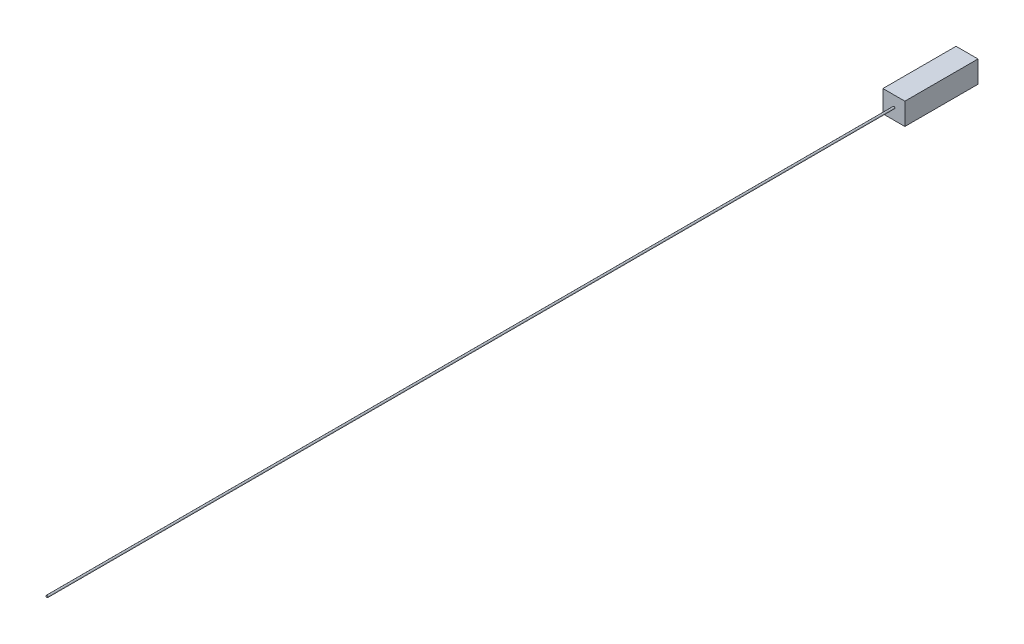
ISO-10303-21;
HEADER;
FILE_DESCRIPTION(('STEP AP214'),'2;1');
FILE_NAME('part.step','',(''),(''),'','','');
FILE_SCHEMA(('AUTOMOTIVE_DESIGN { 1 0 10303 214 1 1 1 1 }'));
ENDSEC;
DATA;
#1=APPLICATION_CONTEXT('core data for automotive mechanical design processes');
#2=APPLICATION_PROTOCOL_DEFINITION('international standard','automotive_design',2000,#1);
#3=PRODUCT_CONTEXT('',#1,'mechanical');
#4=PRODUCT('Part','Part','',(#3));
#5=PRODUCT_RELATED_PRODUCT_CATEGORY('part','',(#4));
#6=PRODUCT_DEFINITION_FORMATION('','',#4);
#7=PRODUCT_DEFINITION_CONTEXT('part definition',#1,'design');
#8=PRODUCT_DEFINITION('design','',#6,#7);
#9=PRODUCT_DEFINITION_SHAPE('','',#8);
#10=(LENGTH_UNIT() NAMED_UNIT(*) SI_UNIT(.MILLI.,.METRE.));
#11=(NAMED_UNIT(*) PLANE_ANGLE_UNIT() SI_UNIT($,.RADIAN.));
#12=(NAMED_UNIT(*) SI_UNIT($,.STERADIAN.) SOLID_ANGLE_UNIT());
#13=UNCERTAINTY_MEASURE_WITH_UNIT(LENGTH_MEASURE(1.E-05),#10,'distance_accuracy_value','');
#14=(GEOMETRIC_REPRESENTATION_CONTEXT(3) GLOBAL_UNCERTAINTY_ASSIGNED_CONTEXT((#13)) GLOBAL_UNIT_ASSIGNED_CONTEXT((#10,
#11,#12)) REPRESENTATION_CONTEXT('',''));
#15=CARTESIAN_POINT('',(0.,0.,0.));
#16=DIRECTION('',(0.,0.,1.));
#17=DIRECTION('',(1.,0.,0.));
#18=AXIS2_PLACEMENT_3D('',#15,#16,#17);
#19=CARTESIAN_POINT('',(-2.85,2.85,19.));
#20=DIRECTION('',(1.,0.,0.));
#21=DIRECTION('',(0.,1.,0.));
#22=AXIS2_PLACEMENT_3D('',#19,#20,#21);
#23=PLANE('',#22);
#24=DIRECTION('',(0.,-1.,0.));
#25=VECTOR('',#24,1.);
#26=CARTESIAN_POINT('',(-2.85,2.85,0.));
#27=LINE('',#26,#25);
#28=CARTESIAN_POINT('',(-2.85,2.85,0.));
#29=VERTEX_POINT('',#28);
#30=CARTESIAN_POINT('',(-2.85,-2.85,0.));
#31=VERTEX_POINT('',#30);
#32=EDGE_CURVE('E100',#29,#31,#27,.T.);
#33=ORIENTED_EDGE('',*,*,#32,.T.);
#34=DIRECTION('',(0.,0.,-1.));
#35=VECTOR('',#34,1.);
#36=CARTESIAN_POINT('',(-2.85,-2.85,19.));
#37=LINE('',#36,#35);
#38=CARTESIAN_POINT('',(-2.85,-2.85,19.));
#39=VERTEX_POINT('',#38);
#40=EDGE_CURVE('E42',#39,#31,#37,.T.);
#41=ORIENTED_EDGE('',*,*,#40,.F.);
#42=DIRECTION('',(0.,-1.,0.));
#43=VECTOR('',#42,1.);
#44=CARTESIAN_POINT('',(-2.85,2.85,19.));
#45=LINE('',#44,#43);
#46=CARTESIAN_POINT('',(-2.85,2.85,19.));
#47=VERTEX_POINT('',#46);
#48=EDGE_CURVE('E86',#47,#39,#45,.T.);
#49=ORIENTED_EDGE('',*,*,#48,.F.);
#50=DIRECTION('',(0.,0.,-1.));
#51=VECTOR('',#50,1.);
#52=CARTESIAN_POINT('',(-2.85,2.85,19.));
#53=LINE('',#52,#51);
#54=EDGE_CURVE('E96',#47,#29,#53,.T.);
#55=ORIENTED_EDGE('',*,*,#54,.T.);
#56=EDGE_LOOP('',(#33,#41,#49,#55));
#57=FACE_BOUND('',#56,.T.);
#58=ADVANCED_FACE('F34',(#57),#23,.F.);
#59=CARTESIAN_POINT('',(2.85,-2.85,19.));
#60=DIRECTION('',(0.,1.,0.));
#61=DIRECTION('',(-1.,0.,0.));
#62=AXIS2_PLACEMENT_3D('',#59,#60,#61);
#63=PLANE('',#62);
#64=DIRECTION('',(1.,0.,0.));
#65=VECTOR('',#64,1.);
#66=CARTESIAN_POINT('',(2.85,-2.85,0.));
#67=LINE('',#66,#65);
#68=CARTESIAN_POINT('',(2.85,-2.85,0.));
#69=VERTEX_POINT('',#68);
#70=EDGE_CURVE('E91',#31,#69,#67,.T.);
#71=ORIENTED_EDGE('',*,*,#70,.T.);
#72=DIRECTION('',(0.,0.,-1.));
#73=VECTOR('',#72,1.);
#74=CARTESIAN_POINT('',(2.85,-2.85,19.));
#75=LINE('',#74,#73);
#76=CARTESIAN_POINT('',(2.85,-2.85,19.));
#77=VERTEX_POINT('',#76);
#78=EDGE_CURVE('E89',#77,#69,#75,.T.);
#79=ORIENTED_EDGE('',*,*,#78,.F.);
#80=DIRECTION('',(1.,0.,0.));
#81=VECTOR('',#80,1.);
#82=CARTESIAN_POINT('',(2.85,-2.85,19.));
#83=LINE('',#82,#81);
#84=EDGE_CURVE('E81',#39,#77,#83,.T.);
#85=ORIENTED_EDGE('',*,*,#84,.F.);
#86=ORIENTED_EDGE('',*,*,#40,.T.);
#87=EDGE_LOOP('',(#71,#79,#85,#86));
#88=FACE_BOUND('',#87,.T.);
#89=ADVANCED_FACE('F90',(#88),#63,.F.);
#90=CARTESIAN_POINT('',(2.85,2.85,19.));
#91=DIRECTION('',(-1.,0.,0.));
#92=DIRECTION('',(0.,-1.,0.));
#93=AXIS2_PLACEMENT_3D('',#90,#91,#92);
#94=PLANE('',#93);
#95=DIRECTION('',(0.,1.,0.));
#96=VECTOR('',#95,1.);
#97=CARTESIAN_POINT('',(2.85,2.85,0.));
#98=LINE('',#97,#96);
#99=CARTESIAN_POINT('',(2.85,2.85,0.));
#100=VERTEX_POINT('',#99);
#101=EDGE_CURVE('E67',#69,#100,#98,.T.);
#102=ORIENTED_EDGE('',*,*,#101,.T.);
#103=DIRECTION('',(0.,0.,-1.));
#104=VECTOR('',#103,1.);
#105=CARTESIAN_POINT('',(2.85,2.85,19.));
#106=LINE('',#105,#104);
#107=CARTESIAN_POINT('',(2.85,2.85,19.));
#108=VERTEX_POINT('',#107);
#109=EDGE_CURVE('E92',#108,#100,#106,.T.);
#110=ORIENTED_EDGE('',*,*,#109,.F.);
#111=DIRECTION('',(0.,1.,0.));
#112=VECTOR('',#111,1.);
#113=CARTESIAN_POINT('',(2.85,2.85,19.));
#114=LINE('',#113,#112);
#115=EDGE_CURVE('E84',#77,#108,#114,.T.);
#116=ORIENTED_EDGE('',*,*,#115,.F.);
#117=ORIENTED_EDGE('',*,*,#78,.T.);
#118=EDGE_LOOP('',(#102,#110,#116,#117));
#119=FACE_BOUND('',#118,.T.);
#120=ADVANCED_FACE('F94',(#119),#94,.F.);
#121=CARTESIAN_POINT('',(2.85,2.85,19.));
#122=DIRECTION('',(0.,-1.,0.));
#123=DIRECTION('',(1.,0.,0.));
#124=AXIS2_PLACEMENT_3D('',#121,#122,#123);
#125=PLANE('',#124);
#126=DIRECTION('',(-1.,0.,0.));
#127=VECTOR('',#126,1.);
#128=CARTESIAN_POINT('',(2.85,2.85,0.));
#129=LINE('',#128,#127);
#130=EDGE_CURVE('E73',#100,#29,#129,.T.);
#131=ORIENTED_EDGE('',*,*,#130,.T.);
#132=ORIENTED_EDGE('',*,*,#54,.F.);
#133=DIRECTION('',(-1.,0.,0.));
#134=VECTOR('',#133,1.);
#135=CARTESIAN_POINT('',(2.85,2.85,19.));
#136=LINE('',#135,#134);
#137=EDGE_CURVE('E50',#108,#47,#136,.T.);
#138=ORIENTED_EDGE('',*,*,#137,.F.);
#139=ORIENTED_EDGE('',*,*,#109,.T.);
#140=EDGE_LOOP('',(#131,#132,#138,#139));
#141=FACE_BOUND('',#140,.T.);
#142=ADVANCED_FACE('F122',(#141),#125,.F.);
#143=CARTESIAN_POINT('',(0.,0.,19.));
#144=DIRECTION('',(0.,0.,-1.));
#145=DIRECTION('',(-1.,0.,0.));
#146=AXIS2_PLACEMENT_3D('',#143,#144,#145);
#147=PLANE('',#146);
#148=CARTESIAN_POINT('',(0.,0.,19.));
#149=DIRECTION('',(0.,0.,-1.));
#150=DIRECTION('',(-1.,0.,0.));
#151=AXIS2_PLACEMENT_3D('',#148,#149,#150);
#152=CIRCLE('',#151,0.25);
#153=CARTESIAN_POINT('',(-0.25,0.,19.));
#154=VERTEX_POINT('',#153);
#155=EDGE_CURVE('E11',#154,#154,#152,.F.);
#156=ORIENTED_EDGE('',*,*,#155,.F.);
#157=EDGE_LOOP('',(#156));
#158=FACE_BOUND('',#157,.T.);
#159=ORIENTED_EDGE('',*,*,#48,.T.);
#160=ORIENTED_EDGE('',*,*,#84,.T.);
#161=ORIENTED_EDGE('',*,*,#115,.T.);
#162=ORIENTED_EDGE('',*,*,#137,.T.);
#163=EDGE_LOOP('',(#159,#160,#161,#162));
#164=FACE_BOUND('',#163,.T.);
#165=ADVANCED_FACE('F82',(#158,#164),#147,.F.);
#166=CARTESIAN_POINT('',(0.,0.,0.));
#167=DIRECTION('',(0.,0.,-1.));
#168=DIRECTION('',(-1.,0.,0.));
#169=AXIS2_PLACEMENT_3D('',#166,#167,#168);
#170=PLANE('',#169);
#171=ORIENTED_EDGE('',*,*,#32,.F.);
#172=ORIENTED_EDGE('',*,*,#130,.F.);
#173=ORIENTED_EDGE('',*,*,#101,.F.);
#174=ORIENTED_EDGE('',*,*,#70,.F.);
#175=EDGE_LOOP('',(#171,#172,#173,#174));
#176=FACE_BOUND('',#175,.T.);
#177=ADVANCED_FACE('F111',(#176),#170,.T.);
#178=CARTESIAN_POINT('',(0.,0.,239.));
#179=DIRECTION('',(0.,0.,-1.));
#180=DIRECTION('',(-1.,0.,0.));
#181=AXIS2_PLACEMENT_3D('',#178,#179,#180);
#182=CYLINDRICAL_SURFACE('',#181,0.25);
#183=CARTESIAN_POINT('',(0.,0.,239.));
#184=DIRECTION('',(0.,0.,1.));
#185=DIRECTION('',(1.,0.,0.));
#186=AXIS2_PLACEMENT_3D('',#183,#184,#185);
#187=CIRCLE('',#186,0.25);
#188=CARTESIAN_POINT('',(0.25,0.,239.));
#189=VERTEX_POINT('',#188);
#190=EDGE_CURVE('E103',#189,#189,#187,.T.);
#191=ORIENTED_EDGE('',*,*,#190,.F.);
#192=EDGE_LOOP('',(#191));
#193=FACE_BOUND('',#192,.T.);
#194=ORIENTED_EDGE('',*,*,#155,.T.);
#195=EDGE_LOOP('',(#194));
#196=FACE_BOUND('',#195,.T.);
#197=ADVANCED_FACE('F113',(#193,#196),#182,.T.);
#198=CARTESIAN_POINT('',(0.,0.,239.));
#199=DIRECTION('',(0.,0.,1.));
#200=DIRECTION('',(1.,0.,0.));
#201=AXIS2_PLACEMENT_3D('',#198,#199,#200);
#202=PLANE('',#201);
#203=ORIENTED_EDGE('',*,*,#190,.T.);
#204=EDGE_LOOP('',(#203));
#205=FACE_BOUND('',#204,.T.);
#206=ADVANCED_FACE('F119',(#205),#202,.T.);
#207=CLOSED_SHELL('',(#58,#89,#120,#142,#165,#177,#197,#206));
#208=MANIFOLD_SOLID_BREP('B2',#207);
#209=ADVANCED_BREP_SHAPE_REPRESENTATION('',(#18,#208),#14);
#210=SHAPE_DEFINITION_REPRESENTATION(#9,#209);
ENDSEC;
END-ISO-10303-21;
